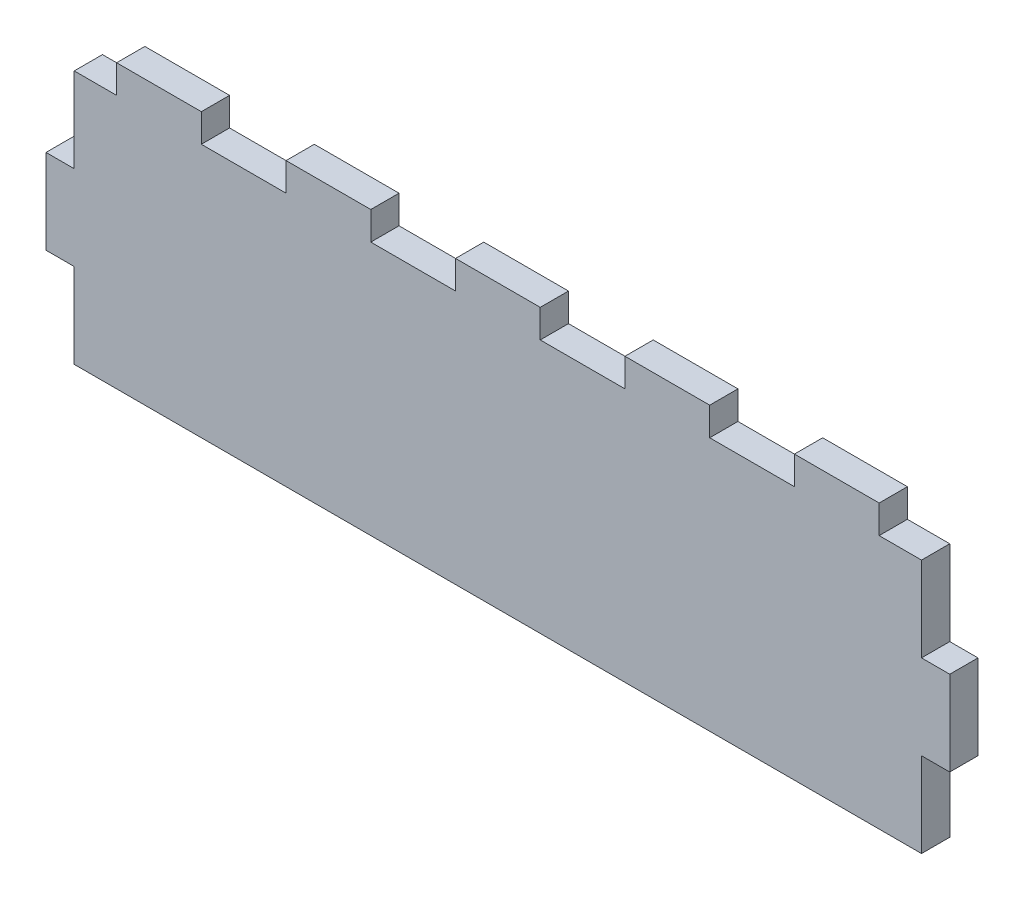
ISO-10303-21;
HEADER;
FILE_DESCRIPTION(('STEP AP214'),'2;1');
FILE_NAME('part.step','',(''),(''),'','','');
FILE_SCHEMA(('AUTOMOTIVE_DESIGN { 1 0 10303 214 1 1 1 1 }'));
ENDSEC;
DATA;
#1=APPLICATION_CONTEXT('core data for automotive mechanical design processes');
#2=APPLICATION_PROTOCOL_DEFINITION('international standard','automotive_design',2000,#1);
#3=PRODUCT_CONTEXT('',#1,'mechanical');
#4=PRODUCT('Part','Part','',(#3));
#5=PRODUCT_RELATED_PRODUCT_CATEGORY('part','',(#4));
#6=PRODUCT_DEFINITION_FORMATION('','',#4);
#7=PRODUCT_DEFINITION_CONTEXT('part definition',#1,'design');
#8=PRODUCT_DEFINITION('design','',#6,#7);
#9=PRODUCT_DEFINITION_SHAPE('','',#8);
#10=(LENGTH_UNIT() NAMED_UNIT(*) SI_UNIT(.MILLI.,.METRE.));
#11=(NAMED_UNIT(*) PLANE_ANGLE_UNIT() SI_UNIT($,.RADIAN.));
#12=(NAMED_UNIT(*) SI_UNIT($,.STERADIAN.) SOLID_ANGLE_UNIT());
#13=UNCERTAINTY_MEASURE_WITH_UNIT(LENGTH_MEASURE(1.E-05),#10,'distance_accuracy_value','');
#14=(GEOMETRIC_REPRESENTATION_CONTEXT(3) GLOBAL_UNCERTAINTY_ASSIGNED_CONTEXT((#13)) GLOBAL_UNIT_ASSIGNED_CONTEXT((#10,
#11,#12)) REPRESENTATION_CONTEXT('',''));
#15=CARTESIAN_POINT('',(0.,0.,0.));
#16=DIRECTION('',(0.,0.,1.));
#17=DIRECTION('',(1.,0.,0.));
#18=AXIS2_PLACEMENT_3D('',#15,#16,#17);
#19=CARTESIAN_POINT('',(101.6,31.75,3.175));
#20=DIRECTION('',(-1.,0.,0.));
#21=DIRECTION('',(0.,0.,1.));
#22=AXIS2_PLACEMENT_3D('',#19,#20,#21);
#23=PLANE('',#22);
#24=DIRECTION('',(0.,0.,1.));
#25=VECTOR('',#24,1.);
#26=CARTESIAN_POINT('',(101.6,6.35,-3.175));
#27=LINE('',#26,#25);
#28=CARTESIAN_POINT('',(101.6,6.35,-3.175));
#29=VERTEX_POINT('',#28);
#30=CARTESIAN_POINT('',(101.6,6.35,3.175));
#31=VERTEX_POINT('',#30);
#32=EDGE_CURVE('E248',#29,#31,#27,.T.);
#33=ORIENTED_EDGE('',*,*,#32,.T.);
#34=DIRECTION('',(0.,1.,0.));
#35=VECTOR('',#34,1.);
#36=CARTESIAN_POINT('',(101.6,31.75,3.175));
#37=LINE('',#36,#35);
#38=CARTESIAN_POINT('',(101.6,-12.7,3.175));
#39=VERTEX_POINT('',#38);
#40=EDGE_CURVE('E455',#39,#31,#37,.T.);
#41=ORIENTED_EDGE('',*,*,#40,.F.);
#42=DIRECTION('',(0.,0.,1.));
#43=VECTOR('',#42,1.);
#44=CARTESIAN_POINT('',(101.6,-12.7,-3.175));
#45=LINE('',#44,#43);
#46=CARTESIAN_POINT('',(101.6,-12.7,-3.175));
#47=VERTEX_POINT('',#46);
#48=EDGE_CURVE('E276',#47,#39,#45,.T.);
#49=ORIENTED_EDGE('',*,*,#48,.F.);
#50=DIRECTION('',(0.,1.,0.));
#51=VECTOR('',#50,1.);
#52=CARTESIAN_POINT('',(101.6,31.75,-3.175));
#53=LINE('',#52,#51);
#54=EDGE_CURVE('E452',#47,#29,#53,.T.);
#55=ORIENTED_EDGE('',*,*,#54,.T.);
#56=EDGE_LOOP('',(#33,#41,#49,#55));
#57=FACE_BOUND('',#56,.T.);
#58=ADVANCED_FACE('F33',(#57),#23,.F.);
#59=CARTESIAN_POINT('',(0.,0.,3.175));
#60=DIRECTION('',(0.,0.,1.));
#61=DIRECTION('',(1.,0.,0.));
#62=AXIS2_PLACEMENT_3D('',#59,#60,#61);
#63=PLANE('',#62);
#64=ORIENTED_EDGE('',*,*,#40,.T.);
#65=DIRECTION('',(-1.,0.,0.));
#66=VECTOR('',#65,1.);
#67=CARTESIAN_POINT('',(101.6,6.35,3.175));
#68=LINE('',#67,#66);
#69=CARTESIAN_POINT('',(95.25,6.35,3.175));
#70=VERTEX_POINT('',#69);
#71=EDGE_CURVE('E263',#31,#70,#68,.T.);
#72=ORIENTED_EDGE('',*,*,#71,.T.);
#73=DIRECTION('',(0.,1.,0.));
#74=VECTOR('',#73,1.);
#75=CARTESIAN_POINT('',(95.25,25.4,3.175));
#76=LINE('',#75,#74);
#77=CARTESIAN_POINT('',(95.25,25.4,3.175));
#78=VERTEX_POINT('',#77);
#79=EDGE_CURVE('E256',#70,#78,#76,.T.);
#80=ORIENTED_EDGE('',*,*,#79,.T.);
#81=DIRECTION('',(-1.,0.,0.));
#82=VECTOR('',#81,1.);
#83=CARTESIAN_POINT('',(101.6,25.4,3.175));
#84=LINE('',#83,#82);
#85=CARTESIAN_POINT('',(85.725,25.4,3.175));
#86=VERTEX_POINT('',#85);
#87=EDGE_CURVE('E428',#78,#86,#84,.T.);
#88=ORIENTED_EDGE('',*,*,#87,.T.);
#89=DIRECTION('',(0.,1.,0.));
#90=VECTOR('',#89,1.);
#91=CARTESIAN_POINT('',(85.725,31.75,3.175));
#92=LINE('',#91,#90);
#93=CARTESIAN_POINT('',(85.725,31.75,3.175));
#94=VERTEX_POINT('',#93);
#95=EDGE_CURVE('E419',#86,#94,#92,.T.);
#96=ORIENTED_EDGE('',*,*,#95,.T.);
#97=DIRECTION('',(-1.,0.,0.));
#98=VECTOR('',#97,1.);
#99=CARTESIAN_POINT('',(-101.6,31.75,3.175));
#100=LINE('',#99,#98);
#101=CARTESIAN_POINT('',(66.675,31.75,3.175));
#102=VERTEX_POINT('',#101);
#103=EDGE_CURVE('E459',#94,#102,#100,.T.);
#104=ORIENTED_EDGE('',*,*,#103,.T.);
#105=DIRECTION('',(0.,1.,0.));
#106=VECTOR('',#105,1.);
#107=CARTESIAN_POINT('',(66.675,31.75,3.175));
#108=LINE('',#107,#106);
#109=CARTESIAN_POINT('',(66.675,25.4,3.175));
#110=VERTEX_POINT('',#109);
#111=EDGE_CURVE('E379',#110,#102,#108,.T.);
#112=ORIENTED_EDGE('',*,*,#111,.F.);
#113=DIRECTION('',(1.,0.,0.));
#114=VECTOR('',#113,1.);
#115=CARTESIAN_POINT('',(47.625,25.4,3.175));
#116=LINE('',#115,#114);
#117=CARTESIAN_POINT('',(47.625,25.4,3.175));
#118=VERTEX_POINT('',#117);
#119=EDGE_CURVE('E388',#118,#110,#116,.T.);
#120=ORIENTED_EDGE('',*,*,#119,.F.);
#121=DIRECTION('',(0.,-1.,0.));
#122=VECTOR('',#121,1.);
#123=CARTESIAN_POINT('',(47.625,31.75,3.175));
#124=LINE('',#123,#122);
#125=CARTESIAN_POINT('',(47.625,31.75,3.175));
#126=VERTEX_POINT('',#125);
#127=EDGE_CURVE('E301',#126,#118,#124,.T.);
#128=ORIENTED_EDGE('',*,*,#127,.F.);
#129=CARTESIAN_POINT('',(28.5749999999999,31.75,3.175));
#130=VERTEX_POINT('',#129);
#131=EDGE_CURVE('E462',#126,#130,#100,.T.);
#132=ORIENTED_EDGE('',*,*,#131,.T.);
#133=DIRECTION('',(0.,1.,0.));
#134=VECTOR('',#133,1.);
#135=CARTESIAN_POINT('',(28.5749999999999,31.75,3.175));
#136=LINE('',#135,#134);
#137=CARTESIAN_POINT('',(28.5749999999999,25.4,3.175));
#138=VERTEX_POINT('',#137);
#139=EDGE_CURVE('E353',#138,#130,#136,.T.);
#140=ORIENTED_EDGE('',*,*,#139,.F.);
#141=DIRECTION('',(1.,0.,0.));
#142=VECTOR('',#141,1.);
#143=CARTESIAN_POINT('',(9.52499999999998,25.4,3.175));
#144=LINE('',#143,#142);
#145=CARTESIAN_POINT('',(9.52499999999998,25.4,3.175));
#146=VERTEX_POINT('',#145);
#147=EDGE_CURVE('E363',#146,#138,#144,.T.);
#148=ORIENTED_EDGE('',*,*,#147,.F.);
#149=DIRECTION('',(0.,-1.,0.));
#150=VECTOR('',#149,1.);
#151=CARTESIAN_POINT('',(9.52499999999995,31.75,3.175));
#152=LINE('',#151,#150);
#153=CARTESIAN_POINT('',(9.52499999999995,31.75,3.175));
#154=VERTEX_POINT('',#153);
#155=EDGE_CURVE('E360',#154,#146,#152,.T.);
#156=ORIENTED_EDGE('',*,*,#155,.F.);
#157=CARTESIAN_POINT('',(-9.52500000000005,31.75,3.175));
#158=VERTEX_POINT('',#157);
#159=EDGE_CURVE('E547',#154,#158,#100,.T.);
#160=ORIENTED_EDGE('',*,*,#159,.T.);
#161=DIRECTION('',(0.,1.,0.));
#162=VECTOR('',#161,1.);
#163=CARTESIAN_POINT('',(-9.52500000000005,31.75,3.175));
#164=LINE('',#163,#162);
#165=CARTESIAN_POINT('',(-9.52500000000005,25.4,3.175));
#166=VERTEX_POINT('',#165);
#167=EDGE_CURVE('E325',#166,#158,#164,.T.);
#168=ORIENTED_EDGE('',*,*,#167,.F.);
#169=DIRECTION('',(1.,0.,0.));
#170=VECTOR('',#169,1.);
#171=CARTESIAN_POINT('',(-28.575,25.4,3.175));
#172=LINE('',#171,#170);
#173=CARTESIAN_POINT('',(-28.575,25.4,3.175));
#174=VERTEX_POINT('',#173);
#175=EDGE_CURVE('E335',#174,#166,#172,.T.);
#176=ORIENTED_EDGE('',*,*,#175,.F.);
#177=DIRECTION('',(0.,-1.,0.));
#178=VECTOR('',#177,1.);
#179=CARTESIAN_POINT('',(-28.5750000000001,31.75,3.175));
#180=LINE('',#179,#178);
#181=CARTESIAN_POINT('',(-28.5750000000001,31.75,3.175));
#182=VERTEX_POINT('',#181);
#183=EDGE_CURVE('E332',#182,#174,#180,.T.);
#184=ORIENTED_EDGE('',*,*,#183,.F.);
#185=CARTESIAN_POINT('',(-47.6250000000001,31.75,3.175));
#186=VERTEX_POINT('',#185);
#187=EDGE_CURVE('E463',#182,#186,#100,.T.);
#188=ORIENTED_EDGE('',*,*,#187,.T.);
#189=DIRECTION('',(0.,1.,0.));
#190=VECTOR('',#189,1.);
#191=CARTESIAN_POINT('',(-47.6250000000001,31.75,3.175));
#192=LINE('',#191,#190);
#193=CARTESIAN_POINT('',(-47.6250000000001,25.4,3.175));
#194=VERTEX_POINT('',#193);
#195=EDGE_CURVE('E403',#194,#186,#192,.T.);
#196=ORIENTED_EDGE('',*,*,#195,.F.);
#197=DIRECTION('',(1.,0.,0.));
#198=VECTOR('',#197,1.);
#199=CARTESIAN_POINT('',(-66.675,25.4,3.175));
#200=LINE('',#199,#198);
#201=CARTESIAN_POINT('',(-66.675,25.4,3.175));
#202=VERTEX_POINT('',#201);
#203=EDGE_CURVE('E412',#202,#194,#200,.T.);
#204=ORIENTED_EDGE('',*,*,#203,.F.);
#205=DIRECTION('',(0.,-1.,0.));
#206=VECTOR('',#205,1.);
#207=CARTESIAN_POINT('',(-66.6750000000001,31.75,3.175));
#208=LINE('',#207,#206);
#209=CARTESIAN_POINT('',(-66.6750000000001,31.75,3.175));
#210=VERTEX_POINT('',#209);
#211=EDGE_CURVE('E342',#210,#202,#208,.T.);
#212=ORIENTED_EDGE('',*,*,#211,.F.);
#213=CARTESIAN_POINT('',(-85.725,31.75,3.175));
#214=VERTEX_POINT('',#213);
#215=EDGE_CURVE('E458',#210,#214,#100,.T.);
#216=ORIENTED_EDGE('',*,*,#215,.T.);
#217=DIRECTION('',(0.,1.,0.));
#218=VECTOR('',#217,1.);
#219=CARTESIAN_POINT('',(-85.725,31.75,3.175));
#220=LINE('',#219,#218);
#221=CARTESIAN_POINT('',(-85.725,25.4,3.175));
#222=VERTEX_POINT('',#221);
#223=EDGE_CURVE('E442',#222,#214,#220,.T.);
#224=ORIENTED_EDGE('',*,*,#223,.F.);
#225=DIRECTION('',(1.,0.,0.));
#226=VECTOR('',#225,1.);
#227=CARTESIAN_POINT('',(-101.6,25.4,3.175));
#228=LINE('',#227,#226);
#229=CARTESIAN_POINT('',(-95.25,25.4,3.175));
#230=VERTEX_POINT('',#229);
#231=EDGE_CURVE('E437',#230,#222,#228,.T.);
#232=ORIENTED_EDGE('',*,*,#231,.F.);
#233=DIRECTION('',(0.,1.,0.));
#234=VECTOR('',#233,1.);
#235=CARTESIAN_POINT('',(-95.25,25.4,3.175));
#236=LINE('',#235,#234);
#237=CARTESIAN_POINT('',(-95.25,6.35,3.175));
#238=VERTEX_POINT('',#237);
#239=EDGE_CURVE('E289',#238,#230,#236,.T.);
#240=ORIENTED_EDGE('',*,*,#239,.F.);
#241=DIRECTION('',(1.,0.,0.));
#242=VECTOR('',#241,1.);
#243=CARTESIAN_POINT('',(-101.6,6.35,3.175));
#244=LINE('',#243,#242);
#245=CARTESIAN_POINT('',(-101.6,6.35,3.175));
#246=VERTEX_POINT('',#245);
#247=EDGE_CURVE('E293',#246,#238,#244,.T.);
#248=ORIENTED_EDGE('',*,*,#247,.F.);
#249=DIRECTION('',(0.,-1.,0.));
#250=VECTOR('',#249,1.);
#251=CARTESIAN_POINT('',(-101.6,31.75,3.175));
#252=LINE('',#251,#250);
#253=CARTESIAN_POINT('',(-101.6,-12.7,3.175));
#254=VERTEX_POINT('',#253);
#255=EDGE_CURVE('E41',#246,#254,#252,.T.);
#256=ORIENTED_EDGE('',*,*,#255,.T.);
#257=DIRECTION('',(-1.,0.,0.));
#258=VECTOR('',#257,1.);
#259=CARTESIAN_POINT('',(-101.6,-12.7,3.175));
#260=LINE('',#259,#258);
#261=CARTESIAN_POINT('',(-95.25,-12.7,3.175));
#262=VERTEX_POINT('',#261);
#263=EDGE_CURVE('E309',#262,#254,#260,.T.);
#264=ORIENTED_EDGE('',*,*,#263,.F.);
#265=DIRECTION('',(0.,1.,0.));
#266=VECTOR('',#265,1.);
#267=CARTESIAN_POINT('',(-95.25,-31.75,3.175));
#268=LINE('',#267,#266);
#269=CARTESIAN_POINT('',(-95.25,-31.75,3.175));
#270=VERTEX_POINT('',#269);
#271=EDGE_CURVE('E269',#270,#262,#268,.T.);
#272=ORIENTED_EDGE('',*,*,#271,.F.);
#273=DIRECTION('',(1.,0.,0.));
#274=VECTOR('',#273,1.);
#275=CARTESIAN_POINT('',(-101.6,-31.75,3.175));
#276=LINE('',#275,#274);
#277=CARTESIAN_POINT('',(95.25,-31.75,3.175));
#278=VERTEX_POINT('',#277);
#279=EDGE_CURVE('E11',#270,#278,#276,.T.);
#280=ORIENTED_EDGE('',*,*,#279,.T.);
#281=DIRECTION('',(0.,1.,0.));
#282=VECTOR('',#281,1.);
#283=CARTESIAN_POINT('',(95.25,-31.75,3.175));
#284=LINE('',#283,#282);
#285=CARTESIAN_POINT('',(95.25,-12.7,3.175));
#286=VERTEX_POINT('',#285);
#287=EDGE_CURVE('E49',#278,#286,#284,.T.);
#288=ORIENTED_EDGE('',*,*,#287,.T.);
#289=DIRECTION('',(1.,0.,0.));
#290=VECTOR('',#289,1.);
#291=CARTESIAN_POINT('',(101.6,-12.7,3.175));
#292=LINE('',#291,#290);
#293=EDGE_CURVE('E277',#286,#39,#292,.T.);
#294=ORIENTED_EDGE('',*,*,#293,.T.);
#295=EDGE_LOOP('',(#64,#72,#80,#88,#96,#104,#112,#120,#128,#132,#140,#148,#156,#160,#168,#176,
#184,#188,#196,#204,#212,#216,#224,#232,#240,#248,#256,#264,#272,#280,#288,#294));
#296=FACE_BOUND('',#295,.T.);
#297=ADVANCED_FACE('F493',(#296),#63,.T.);
#298=CARTESIAN_POINT('',(0.,0.,-3.175));
#299=DIRECTION('',(0.,0.,1.));
#300=DIRECTION('',(1.,0.,0.));
#301=AXIS2_PLACEMENT_3D('',#298,#299,#300);
#302=PLANE('',#301);
#303=DIRECTION('',(-1.,0.,0.));
#304=VECTOR('',#303,1.);
#305=CARTESIAN_POINT('',(101.6,6.35,-3.175));
#306=LINE('',#305,#304);
#307=CARTESIAN_POINT('',(95.25,6.35,-3.175));
#308=VERTEX_POINT('',#307);
#309=EDGE_CURVE('E243',#29,#308,#306,.T.);
#310=ORIENTED_EDGE('',*,*,#309,.F.);
#311=ORIENTED_EDGE('',*,*,#54,.F.);
#312=DIRECTION('',(1.,0.,0.));
#313=VECTOR('',#312,1.);
#314=CARTESIAN_POINT('',(101.6,-12.7,-3.175));
#315=LINE('',#314,#313);
#316=CARTESIAN_POINT('',(95.25,-12.7,-3.175));
#317=VERTEX_POINT('',#316);
#318=EDGE_CURVE('E272',#317,#47,#315,.T.);
#319=ORIENTED_EDGE('',*,*,#318,.F.);
#320=DIRECTION('',(0.,1.,0.));
#321=VECTOR('',#320,1.);
#322=CARTESIAN_POINT('',(95.25,-31.75,-3.175));
#323=LINE('',#322,#321);
#324=CARTESIAN_POINT('',(95.25,-31.75,-3.175));
#325=VERTEX_POINT('',#324);
#326=EDGE_CURVE('E274',#325,#317,#323,.T.);
#327=ORIENTED_EDGE('',*,*,#326,.F.);
#328=DIRECTION('',(1.,0.,0.));
#329=VECTOR('',#328,1.);
#330=CARTESIAN_POINT('',(-101.6,-31.75,-3.175));
#331=LINE('',#330,#329);
#332=CARTESIAN_POINT('',(-95.25,-31.75,-3.175));
#333=VERTEX_POINT('',#332);
#334=EDGE_CURVE('E36',#333,#325,#331,.T.);
#335=ORIENTED_EDGE('',*,*,#334,.F.);
#336=DIRECTION('',(0.,1.,0.));
#337=VECTOR('',#336,1.);
#338=CARTESIAN_POINT('',(-95.25,-31.75,-3.175));
#339=LINE('',#338,#337);
#340=CARTESIAN_POINT('',(-95.25,-12.7,-3.175));
#341=VERTEX_POINT('',#340);
#342=EDGE_CURVE('E305',#333,#341,#339,.T.);
#343=ORIENTED_EDGE('',*,*,#342,.T.);
#344=DIRECTION('',(-1.,0.,0.));
#345=VECTOR('',#344,1.);
#346=CARTESIAN_POINT('',(-101.6,-12.7,-3.175));
#347=LINE('',#346,#345);
#348=CARTESIAN_POINT('',(-101.6,-12.7,-3.175));
#349=VERTEX_POINT('',#348);
#350=EDGE_CURVE('E308',#341,#349,#347,.T.);
#351=ORIENTED_EDGE('',*,*,#350,.T.);
#352=DIRECTION('',(0.,-1.,0.));
#353=VECTOR('',#352,1.);
#354=CARTESIAN_POINT('',(-101.6,31.75,-3.175));
#355=LINE('',#354,#353);
#356=CARTESIAN_POINT('',(-101.6,6.35,-3.175));
#357=VERTEX_POINT('',#356);
#358=EDGE_CURVE('E470',#357,#349,#355,.T.);
#359=ORIENTED_EDGE('',*,*,#358,.F.);
#360=DIRECTION('',(1.,0.,0.));
#361=VECTOR('',#360,1.);
#362=CARTESIAN_POINT('',(-101.6,6.35,-3.175));
#363=LINE('',#362,#361);
#364=CARTESIAN_POINT('',(-95.25,6.35,-3.175));
#365=VERTEX_POINT('',#364);
#366=EDGE_CURVE('E285',#357,#365,#363,.T.);
#367=ORIENTED_EDGE('',*,*,#366,.T.);
#368=DIRECTION('',(0.,1.,0.));
#369=VECTOR('',#368,1.);
#370=CARTESIAN_POINT('',(-95.25,25.4,-3.175));
#371=LINE('',#370,#369);
#372=CARTESIAN_POINT('',(-95.25,25.4,-3.175));
#373=VERTEX_POINT('',#372);
#374=EDGE_CURVE('E288',#365,#373,#371,.T.);
#375=ORIENTED_EDGE('',*,*,#374,.T.);
#376=DIRECTION('',(1.,0.,0.));
#377=VECTOR('',#376,1.);
#378=CARTESIAN_POINT('',(-101.6,25.4,-3.175));
#379=LINE('',#378,#377);
#380=CARTESIAN_POINT('',(-85.725,25.4,-3.175));
#381=VERTEX_POINT('',#380);
#382=EDGE_CURVE('E439',#373,#381,#379,.T.);
#383=ORIENTED_EDGE('',*,*,#382,.T.);
#384=DIRECTION('',(0.,1.,0.));
#385=VECTOR('',#384,1.);
#386=CARTESIAN_POINT('',(-85.725,31.75,-3.175));
#387=LINE('',#386,#385);
#388=CARTESIAN_POINT('',(-85.725,31.75,-3.175));
#389=VERTEX_POINT('',#388);
#390=EDGE_CURVE('E441',#381,#389,#387,.T.);
#391=ORIENTED_EDGE('',*,*,#390,.T.);
#392=DIRECTION('',(-1.,0.,0.));
#393=VECTOR('',#392,1.);
#394=CARTESIAN_POINT('',(-101.6,31.75,-3.175));
#395=LINE('',#394,#393);
#396=CARTESIAN_POINT('',(-66.6750000000001,31.75,-3.175));
#397=VERTEX_POINT('',#396);
#398=EDGE_CURVE('E467',#397,#389,#395,.T.);
#399=ORIENTED_EDGE('',*,*,#398,.F.);
#400=DIRECTION('',(0.,-1.,0.));
#401=VECTOR('',#400,1.);
#402=CARTESIAN_POINT('',(-66.6750000000001,31.75,-3.175));
#403=LINE('',#402,#401);
#404=CARTESIAN_POINT('',(-66.675,25.4,-3.175));
#405=VERTEX_POINT('',#404);
#406=EDGE_CURVE('E399',#397,#405,#403,.T.);
#407=ORIENTED_EDGE('',*,*,#406,.T.);
#408=DIRECTION('',(1.,0.,0.));
#409=VECTOR('',#408,1.);
#410=CARTESIAN_POINT('',(-66.675,25.4,-3.175));
#411=LINE('',#410,#409);
#412=CARTESIAN_POINT('',(-47.6250000000001,25.4,-3.175));
#413=VERTEX_POINT('',#412);
#414=EDGE_CURVE('E402',#405,#413,#411,.T.);
#415=ORIENTED_EDGE('',*,*,#414,.T.);
#416=DIRECTION('',(0.,1.,0.));
#417=VECTOR('',#416,1.);
#418=CARTESIAN_POINT('',(-47.6250000000001,31.75,-3.175));
#419=LINE('',#418,#417);
#420=CARTESIAN_POINT('',(-47.6250000000001,31.75,-3.175));
#421=VERTEX_POINT('',#420);
#422=EDGE_CURVE('E406',#413,#421,#419,.T.);
#423=ORIENTED_EDGE('',*,*,#422,.T.);
#424=CARTESIAN_POINT('',(-28.5750000000001,31.75,-3.175));
#425=VERTEX_POINT('',#424);
#426=EDGE_CURVE('E472',#425,#421,#395,.T.);
#427=ORIENTED_EDGE('',*,*,#426,.F.);
#428=DIRECTION('',(0.,-1.,0.));
#429=VECTOR('',#428,1.);
#430=CARTESIAN_POINT('',(-28.5750000000001,31.75,-3.175));
#431=LINE('',#430,#429);
#432=CARTESIAN_POINT('',(-28.575,25.4,-3.175));
#433=VERTEX_POINT('',#432);
#434=EDGE_CURVE('E321',#425,#433,#431,.T.);
#435=ORIENTED_EDGE('',*,*,#434,.T.);
#436=DIRECTION('',(1.,0.,0.));
#437=VECTOR('',#436,1.);
#438=CARTESIAN_POINT('',(-28.575,25.4,-3.175));
#439=LINE('',#438,#437);
#440=CARTESIAN_POINT('',(-9.52500000000005,25.4,-3.175));
#441=VERTEX_POINT('',#440);
#442=EDGE_CURVE('E324',#433,#441,#439,.T.);
#443=ORIENTED_EDGE('',*,*,#442,.T.);
#444=DIRECTION('',(0.,1.,0.));
#445=VECTOR('',#444,1.);
#446=CARTESIAN_POINT('',(-9.52500000000005,31.75,-3.175));
#447=LINE('',#446,#445);
#448=CARTESIAN_POINT('',(-9.52500000000005,31.75,-3.175));
#449=VERTEX_POINT('',#448);
#450=EDGE_CURVE('E328',#441,#449,#447,.T.);
#451=ORIENTED_EDGE('',*,*,#450,.T.);
#452=CARTESIAN_POINT('',(9.52499999999995,31.75,-3.175));
#453=VERTEX_POINT('',#452);
#454=EDGE_CURVE('E525',#453,#449,#395,.T.);
#455=ORIENTED_EDGE('',*,*,#454,.F.);
#456=DIRECTION('',(0.,-1.,0.));
#457=VECTOR('',#456,1.);
#458=CARTESIAN_POINT('',(9.52499999999995,31.75,-3.175));
#459=LINE('',#458,#457);
#460=CARTESIAN_POINT('',(9.52499999999998,25.4,-3.175));
#461=VERTEX_POINT('',#460);
#462=EDGE_CURVE('E349',#453,#461,#459,.T.);
#463=ORIENTED_EDGE('',*,*,#462,.T.);
#464=DIRECTION('',(1.,0.,0.));
#465=VECTOR('',#464,1.);
#466=CARTESIAN_POINT('',(9.52499999999998,25.4,-3.175));
#467=LINE('',#466,#465);
#468=CARTESIAN_POINT('',(28.5749999999999,25.4,-3.175));
#469=VERTEX_POINT('',#468);
#470=EDGE_CURVE('E352',#461,#469,#467,.T.);
#471=ORIENTED_EDGE('',*,*,#470,.T.);
#472=DIRECTION('',(0.,1.,0.));
#473=VECTOR('',#472,1.);
#474=CARTESIAN_POINT('',(28.5749999999999,31.75,-3.175));
#475=LINE('',#474,#473);
#476=CARTESIAN_POINT('',(28.5749999999999,31.75,-3.175));
#477=VERTEX_POINT('',#476);
#478=EDGE_CURVE('E356',#469,#477,#475,.T.);
#479=ORIENTED_EDGE('',*,*,#478,.T.);
#480=CARTESIAN_POINT('',(47.625,31.75,-3.175));
#481=VERTEX_POINT('',#480);
#482=EDGE_CURVE('E471',#481,#477,#395,.T.);
#483=ORIENTED_EDGE('',*,*,#482,.F.);
#484=DIRECTION('',(0.,-1.,0.));
#485=VECTOR('',#484,1.);
#486=CARTESIAN_POINT('',(47.625,31.75,-3.175));
#487=LINE('',#486,#485);
#488=CARTESIAN_POINT('',(47.625,25.4,-3.175));
#489=VERTEX_POINT('',#488);
#490=EDGE_CURVE('E375',#481,#489,#487,.T.);
#491=ORIENTED_EDGE('',*,*,#490,.T.);
#492=DIRECTION('',(1.,0.,0.));
#493=VECTOR('',#492,1.);
#494=CARTESIAN_POINT('',(47.625,25.4,-3.175));
#495=LINE('',#494,#493);
#496=CARTESIAN_POINT('',(66.675,25.4,-3.175));
#497=VERTEX_POINT('',#496);
#498=EDGE_CURVE('E378',#489,#497,#495,.T.);
#499=ORIENTED_EDGE('',*,*,#498,.T.);
#500=DIRECTION('',(0.,1.,0.));
#501=VECTOR('',#500,1.);
#502=CARTESIAN_POINT('',(66.675,31.75,-3.175));
#503=LINE('',#502,#501);
#504=CARTESIAN_POINT('',(66.675,31.75,-3.175));
#505=VERTEX_POINT('',#504);
#506=EDGE_CURVE('E382',#497,#505,#503,.T.);
#507=ORIENTED_EDGE('',*,*,#506,.T.);
#508=CARTESIAN_POINT('',(85.725,31.75,-3.175));
#509=VERTEX_POINT('',#508);
#510=EDGE_CURVE('E468',#509,#505,#395,.T.);
#511=ORIENTED_EDGE('',*,*,#510,.F.);
#512=DIRECTION('',(0.,1.,0.));
#513=VECTOR('',#512,1.);
#514=CARTESIAN_POINT('',(85.725,31.75,-3.175));
#515=LINE('',#514,#513);
#516=CARTESIAN_POINT('',(85.725,25.4,-3.175));
#517=VERTEX_POINT('',#516);
#518=EDGE_CURVE('E426',#517,#509,#515,.T.);
#519=ORIENTED_EDGE('',*,*,#518,.F.);
#520=DIRECTION('',(-1.,0.,0.));
#521=VECTOR('',#520,1.);
#522=CARTESIAN_POINT('',(101.6,25.4,-3.175));
#523=LINE('',#522,#521);
#524=CARTESIAN_POINT('',(95.25,25.4,-3.175));
#525=VERTEX_POINT('',#524);
#526=EDGE_CURVE('E262',#525,#517,#523,.T.);
#527=ORIENTED_EDGE('',*,*,#526,.F.);
#528=DIRECTION('',(0.,1.,0.));
#529=VECTOR('',#528,1.);
#530=CARTESIAN_POINT('',(95.25,25.4,-3.175));
#531=LINE('',#530,#529);
#532=EDGE_CURVE('E57',#308,#525,#531,.T.);
#533=ORIENTED_EDGE('',*,*,#532,.F.);
#534=EDGE_LOOP('',(#310,#311,#319,#327,#335,#343,#351,#359,#367,#375,#383,#391,#399,#407,#415,
#423,#427,#435,#443,#451,#455,#463,#471,#479,#483,#491,#499,#507,#511,#519,#527,#533));
#535=FACE_BOUND('',#534,.T.);
#536=ADVANCED_FACE('F260',(#535),#302,.F.);
#537=CARTESIAN_POINT('',(-101.6,-31.75,3.175));
#538=DIRECTION('',(0.,1.,0.));
#539=DIRECTION('',(0.,0.,1.));
#540=AXIS2_PLACEMENT_3D('',#537,#538,#539);
#541=PLANE('',#540);
#542=DIRECTION('',(0.,0.,1.));
#543=VECTOR('',#542,1.);
#544=CARTESIAN_POINT('',(95.25,-31.75,-3.175));
#545=LINE('',#544,#543);
#546=EDGE_CURVE('E267',#325,#278,#545,.T.);
#547=ORIENTED_EDGE('',*,*,#546,.T.);
#548=ORIENTED_EDGE('',*,*,#279,.F.);
#549=DIRECTION('',(0.,0.,1.));
#550=VECTOR('',#549,1.);
#551=CARTESIAN_POINT('',(-95.25,-31.75,-3.175));
#552=LINE('',#551,#550);
#553=EDGE_CURVE('E312',#333,#270,#552,.T.);
#554=ORIENTED_EDGE('',*,*,#553,.F.);
#555=ORIENTED_EDGE('',*,*,#334,.T.);
#556=EDGE_LOOP('',(#547,#548,#554,#555));
#557=FACE_BOUND('',#556,.T.);
#558=ADVANCED_FACE('F481',(#557),#541,.F.);
#559=CARTESIAN_POINT('',(101.6,25.4,-3.175));
#560=DIRECTION('',(0.,1.,0.));
#561=DIRECTION('',(-1.,0.,0.));
#562=AXIS2_PLACEMENT_3D('',#559,#560,#561);
#563=PLANE('',#562);
#564=ORIENTED_EDGE('',*,*,#87,.F.);
#565=DIRECTION('',(0.,0.,1.));
#566=VECTOR('',#565,1.);
#567=CARTESIAN_POINT('',(95.25,25.4,-3.175));
#568=LINE('',#567,#566);
#569=EDGE_CURVE('E252',#525,#78,#568,.T.);
#570=ORIENTED_EDGE('',*,*,#569,.F.);
#571=ORIENTED_EDGE('',*,*,#526,.T.);
#572=DIRECTION('',(0.,0.,1.));
#573=VECTOR('',#572,1.);
#574=CARTESIAN_POINT('',(85.725,25.4,-3.175));
#575=LINE('',#574,#573);
#576=EDGE_CURVE('E434',#517,#86,#575,.T.);
#577=ORIENTED_EDGE('',*,*,#576,.T.);
#578=EDGE_LOOP('',(#564,#570,#571,#577));
#579=FACE_BOUND('',#578,.T.);
#580=ADVANCED_FACE('F591',(#579),#563,.T.);
#581=CARTESIAN_POINT('',(-101.6,31.75,3.175));
#582=DIRECTION('',(0.,-1.,0.));
#583=DIRECTION('',(0.,0.,-1.));
#584=AXIS2_PLACEMENT_3D('',#581,#582,#583);
#585=PLANE('',#584);
#586=ORIENTED_EDGE('',*,*,#187,.F.);
#587=DIRECTION('',(0.,0.,1.));
#588=VECTOR('',#587,1.);
#589=CARTESIAN_POINT('',(-28.5750000000001,31.75,-3.175));
#590=LINE('',#589,#588);
#591=EDGE_CURVE('E340',#425,#182,#590,.T.);
#592=ORIENTED_EDGE('',*,*,#591,.F.);
#593=ORIENTED_EDGE('',*,*,#426,.T.);
#594=DIRECTION('',(0.,0.,1.));
#595=VECTOR('',#594,1.);
#596=CARTESIAN_POINT('',(-47.6250000000001,31.75,-3.175));
#597=LINE('',#596,#595);
#598=EDGE_CURVE('E420',#421,#186,#597,.T.);
#599=ORIENTED_EDGE('',*,*,#598,.T.);
#600=EDGE_LOOP('',(#586,#592,#593,#599));
#601=FACE_BOUND('',#600,.T.);
#602=ADVANCED_FACE('F565',(#601),#585,.F.);
#603=ORIENTED_EDGE('',*,*,#454,.T.);
#604=DIRECTION('',(0.,0.,1.));
#605=VECTOR('',#604,1.);
#606=CARTESIAN_POINT('',(-9.52500000000005,31.75,-3.175));
#607=LINE('',#606,#605);
#608=EDGE_CURVE('E343',#449,#158,#607,.T.);
#609=ORIENTED_EDGE('',*,*,#608,.T.);
#610=ORIENTED_EDGE('',*,*,#159,.F.);
#611=DIRECTION('',(0.,0.,1.));
#612=VECTOR('',#611,1.);
#613=CARTESIAN_POINT('',(9.52499999999995,31.75,-3.175));
#614=LINE('',#613,#612);
#615=EDGE_CURVE('E336',#453,#154,#614,.T.);
#616=ORIENTED_EDGE('',*,*,#615,.F.);
#617=EDGE_LOOP('',(#603,#609,#610,#616));
#618=FACE_BOUND('',#617,.T.);
#619=ADVANCED_FACE('F534',(#618),#585,.F.);
#620=ORIENTED_EDGE('',*,*,#482,.T.);
#621=DIRECTION('',(0.,0.,1.));
#622=VECTOR('',#621,1.);
#623=CARTESIAN_POINT('',(28.5749999999999,31.75,-3.175));
#624=LINE('',#623,#622);
#625=EDGE_CURVE('E369',#477,#130,#624,.T.);
#626=ORIENTED_EDGE('',*,*,#625,.T.);
#627=ORIENTED_EDGE('',*,*,#131,.F.);
#628=DIRECTION('',(0.,0.,1.));
#629=VECTOR('',#628,1.);
#630=CARTESIAN_POINT('',(47.625,31.75,-3.175));
#631=LINE('',#630,#629);
#632=EDGE_CURVE('E364',#481,#126,#631,.T.);
#633=ORIENTED_EDGE('',*,*,#632,.F.);
#634=EDGE_LOOP('',(#620,#626,#627,#633));
#635=FACE_BOUND('',#634,.T.);
#636=ADVANCED_FACE('F613',(#635),#585,.F.);
#637=ORIENTED_EDGE('',*,*,#215,.F.);
#638=DIRECTION('',(0.,0.,1.));
#639=VECTOR('',#638,1.);
#640=CARTESIAN_POINT('',(-66.6750000000001,31.75,-3.175));
#641=LINE('',#640,#639);
#642=EDGE_CURVE('E417',#397,#210,#641,.T.);
#643=ORIENTED_EDGE('',*,*,#642,.F.);
#644=ORIENTED_EDGE('',*,*,#398,.T.);
#645=DIRECTION('',(0.,0.,1.));
#646=VECTOR('',#645,1.);
#647=CARTESIAN_POINT('',(-85.725,31.75,-3.175));
#648=LINE('',#647,#646);
#649=EDGE_CURVE('E449',#389,#214,#648,.T.);
#650=ORIENTED_EDGE('',*,*,#649,.T.);
#651=EDGE_LOOP('',(#637,#643,#644,#650));
#652=FACE_BOUND('',#651,.T.);
#653=ADVANCED_FACE('F523',(#652),#585,.F.);
#654=ORIENTED_EDGE('',*,*,#510,.T.);
#655=DIRECTION('',(0.,0.,1.));
#656=VECTOR('',#655,1.);
#657=CARTESIAN_POINT('',(66.675,31.75,-3.175));
#658=LINE('',#657,#656);
#659=EDGE_CURVE('E393',#505,#102,#658,.T.);
#660=ORIENTED_EDGE('',*,*,#659,.T.);
#661=ORIENTED_EDGE('',*,*,#103,.F.);
#662=DIRECTION('',(0.,0.,1.));
#663=VECTOR('',#662,1.);
#664=CARTESIAN_POINT('',(85.725,31.75,-3.175));
#665=LINE('',#664,#663);
#666=EDGE_CURVE('E430',#509,#94,#665,.T.);
#667=ORIENTED_EDGE('',*,*,#666,.F.);
#668=EDGE_LOOP('',(#654,#660,#661,#667));
#669=FACE_BOUND('',#668,.T.);
#670=ADVANCED_FACE('F600',(#669),#585,.F.);
#671=CARTESIAN_POINT('',(-101.6,31.75,3.175));
#672=DIRECTION('',(1.,0.,0.));
#673=DIRECTION('',(0.,1.,0.));
#674=AXIS2_PLACEMENT_3D('',#671,#672,#673);
#675=PLANE('',#674);
#676=ORIENTED_EDGE('',*,*,#255,.F.);
#677=DIRECTION('',(0.,0.,1.));
#678=VECTOR('',#677,1.);
#679=CARTESIAN_POINT('',(-101.6,6.35,-3.175));
#680=LINE('',#679,#678);
#681=EDGE_CURVE('E292',#357,#246,#680,.T.);
#682=ORIENTED_EDGE('',*,*,#681,.F.);
#683=ORIENTED_EDGE('',*,*,#358,.T.);
#684=DIRECTION('',(0.,0.,1.));
#685=VECTOR('',#684,1.);
#686=CARTESIAN_POINT('',(-101.6,-12.7,-3.175));
#687=LINE('',#686,#685);
#688=EDGE_CURVE('E296',#349,#254,#687,.T.);
#689=ORIENTED_EDGE('',*,*,#688,.T.);
#690=EDGE_LOOP('',(#676,#682,#683,#689));
#691=FACE_BOUND('',#690,.T.);
#692=ADVANCED_FACE('F507',(#691),#675,.F.);
#693=CARTESIAN_POINT('',(-85.725,31.75,-3.175));
#694=DIRECTION('',(1.,0.,0.));
#695=DIRECTION('',(0.,0.,-1.));
#696=AXIS2_PLACEMENT_3D('',#693,#694,#695);
#697=PLANE('',#696);
#698=ORIENTED_EDGE('',*,*,#223,.T.);
#699=ORIENTED_EDGE('',*,*,#649,.F.);
#700=ORIENTED_EDGE('',*,*,#390,.F.);
#701=DIRECTION('',(0.,0.,1.));
#702=VECTOR('',#701,1.);
#703=CARTESIAN_POINT('',(-85.725,25.4,-3.175));
#704=LINE('',#703,#702);
#705=EDGE_CURVE('E445',#381,#222,#704,.T.);
#706=ORIENTED_EDGE('',*,*,#705,.T.);
#707=EDGE_LOOP('',(#698,#699,#700,#706));
#708=FACE_BOUND('',#707,.T.);
#709=ADVANCED_FACE('F520',(#708),#697,.F.);
#710=CARTESIAN_POINT('',(-101.6,25.4,-3.175));
#711=DIRECTION('',(0.,-1.,0.));
#712=DIRECTION('',(1.,0.,0.));
#713=AXIS2_PLACEMENT_3D('',#710,#711,#712);
#714=PLANE('',#713);
#715=ORIENTED_EDGE('',*,*,#382,.F.);
#716=DIRECTION('',(0.,0.,1.));
#717=VECTOR('',#716,1.);
#718=CARTESIAN_POINT('',(-95.25,25.4,-3.175));
#719=LINE('',#718,#717);
#720=EDGE_CURVE('E298',#373,#230,#719,.T.);
#721=ORIENTED_EDGE('',*,*,#720,.T.);
#722=ORIENTED_EDGE('',*,*,#231,.T.);
#723=ORIENTED_EDGE('',*,*,#705,.F.);
#724=EDGE_LOOP('',(#715,#721,#722,#723));
#725=FACE_BOUND('',#724,.T.);
#726=ADVANCED_FACE('F514',(#725),#714,.F.);
#727=CARTESIAN_POINT('',(85.725,31.75,-3.175));
#728=DIRECTION('',(1.,0.,0.));
#729=DIRECTION('',(0.,0.,-1.));
#730=AXIS2_PLACEMENT_3D('',#727,#728,#729);
#731=PLANE('',#730);
#732=ORIENTED_EDGE('',*,*,#95,.F.);
#733=ORIENTED_EDGE('',*,*,#576,.F.);
#734=ORIENTED_EDGE('',*,*,#518,.T.);
#735=ORIENTED_EDGE('',*,*,#666,.T.);
#736=EDGE_LOOP('',(#732,#733,#734,#735));
#737=FACE_BOUND('',#736,.T.);
#738=ADVANCED_FACE('F595',(#737),#731,.T.);
#739=CARTESIAN_POINT('',(-66.6750000000001,31.75,-3.175));
#740=DIRECTION('',(-1.,0.,0.));
#741=DIRECTION('',(0.,-1.,0.));
#742=AXIS2_PLACEMENT_3D('',#739,#740,#741);
#743=PLANE('',#742);
#744=ORIENTED_EDGE('',*,*,#211,.T.);
#745=DIRECTION('',(0.,0.,1.));
#746=VECTOR('',#745,1.);
#747=CARTESIAN_POINT('',(-66.675,25.4,-3.175));
#748=LINE('',#747,#746);
#749=EDGE_CURVE('E409',#405,#202,#748,.T.);
#750=ORIENTED_EDGE('',*,*,#749,.F.);
#751=ORIENTED_EDGE('',*,*,#406,.F.);
#752=ORIENTED_EDGE('',*,*,#642,.T.);
#753=EDGE_LOOP('',(#744,#750,#751,#752));
#754=FACE_BOUND('',#753,.T.);
#755=ADVANCED_FACE('F555',(#754),#743,.F.);
#756=CARTESIAN_POINT('',(-47.6250000000001,31.75,-3.175));
#757=DIRECTION('',(1.,0.,0.));
#758=DIRECTION('',(0.,0.,-1.));
#759=AXIS2_PLACEMENT_3D('',#756,#757,#758);
#760=PLANE('',#759);
#761=ORIENTED_EDGE('',*,*,#195,.T.);
#762=ORIENTED_EDGE('',*,*,#598,.F.);
#763=ORIENTED_EDGE('',*,*,#422,.F.);
#764=DIRECTION('',(0.,0.,1.));
#765=VECTOR('',#764,1.);
#766=CARTESIAN_POINT('',(-47.6250000000001,25.4,-3.175));
#767=LINE('',#766,#765);
#768=EDGE_CURVE('E423',#413,#194,#767,.T.);
#769=ORIENTED_EDGE('',*,*,#768,.T.);
#770=EDGE_LOOP('',(#761,#762,#763,#769));
#771=FACE_BOUND('',#770,.T.);
#772=ADVANCED_FACE('F562',(#771),#760,.F.);
#773=CARTESIAN_POINT('',(-66.675,25.4,-3.175));
#774=DIRECTION('',(0.,-1.,0.));
#775=DIRECTION('',(0.,0.,-1.));
#776=AXIS2_PLACEMENT_3D('',#773,#774,#775);
#777=PLANE('',#776);
#778=ORIENTED_EDGE('',*,*,#203,.T.);
#779=ORIENTED_EDGE('',*,*,#768,.F.);
#780=ORIENTED_EDGE('',*,*,#414,.F.);
#781=ORIENTED_EDGE('',*,*,#749,.T.);
#782=EDGE_LOOP('',(#778,#779,#780,#781));
#783=FACE_BOUND('',#782,.T.);
#784=ADVANCED_FACE('F560',(#783),#777,.F.);
#785=CARTESIAN_POINT('',(47.625,31.75,-3.175));
#786=DIRECTION('',(-1.,0.,0.));
#787=DIRECTION('',(0.,-1.,0.));
#788=AXIS2_PLACEMENT_3D('',#785,#786,#787);
#789=PLANE('',#788);
#790=ORIENTED_EDGE('',*,*,#127,.T.);
#791=DIRECTION('',(0.,0.,1.));
#792=VECTOR('',#791,1.);
#793=CARTESIAN_POINT('',(47.625,25.4,-3.175));
#794=LINE('',#793,#792);
#795=EDGE_CURVE('E385',#489,#118,#794,.T.);
#796=ORIENTED_EDGE('',*,*,#795,.F.);
#797=ORIENTED_EDGE('',*,*,#490,.F.);
#798=ORIENTED_EDGE('',*,*,#632,.T.);
#799=EDGE_LOOP('',(#790,#796,#797,#798));
#800=FACE_BOUND('',#799,.T.);
#801=ADVANCED_FACE('F628',(#800),#789,.F.);
#802=CARTESIAN_POINT('',(66.675,31.75,-3.175));
#803=DIRECTION('',(1.,0.,0.));
#804=DIRECTION('',(0.,0.,-1.));
#805=AXIS2_PLACEMENT_3D('',#802,#803,#804);
#806=PLANE('',#805);
#807=ORIENTED_EDGE('',*,*,#111,.T.);
#808=ORIENTED_EDGE('',*,*,#659,.F.);
#809=ORIENTED_EDGE('',*,*,#506,.F.);
#810=DIRECTION('',(0.,0.,1.));
#811=VECTOR('',#810,1.);
#812=CARTESIAN_POINT('',(66.675,25.4,-3.175));
#813=LINE('',#812,#811);
#814=EDGE_CURVE('E396',#497,#110,#813,.T.);
#815=ORIENTED_EDGE('',*,*,#814,.T.);
#816=EDGE_LOOP('',(#807,#808,#809,#815));
#817=FACE_BOUND('',#816,.T.);
#818=ADVANCED_FACE('F603',(#817),#806,.F.);
#819=CARTESIAN_POINT('',(47.625,25.4,-3.175));
#820=DIRECTION('',(0.,-1.,0.));
#821=DIRECTION('',(0.,0.,-1.));
#822=AXIS2_PLACEMENT_3D('',#819,#820,#821);
#823=PLANE('',#822);
#824=ORIENTED_EDGE('',*,*,#119,.T.);
#825=ORIENTED_EDGE('',*,*,#814,.F.);
#826=ORIENTED_EDGE('',*,*,#498,.F.);
#827=ORIENTED_EDGE('',*,*,#795,.T.);
#828=EDGE_LOOP('',(#824,#825,#826,#827));
#829=FACE_BOUND('',#828,.T.);
#830=ADVANCED_FACE('F607',(#829),#823,.F.);
#831=CARTESIAN_POINT('',(9.52499999999995,31.75,-3.175));
#832=DIRECTION('',(-1.,0.,0.));
#833=DIRECTION('',(0.,-1.,0.));
#834=AXIS2_PLACEMENT_3D('',#831,#832,#833);
#835=PLANE('',#834);
#836=ORIENTED_EDGE('',*,*,#155,.T.);
#837=DIRECTION('',(0.,0.,1.));
#838=VECTOR('',#837,1.);
#839=CARTESIAN_POINT('',(9.52499999999998,25.4,-3.175));
#840=LINE('',#839,#838);
#841=EDGE_CURVE('E359',#461,#146,#840,.T.);
#842=ORIENTED_EDGE('',*,*,#841,.F.);
#843=ORIENTED_EDGE('',*,*,#462,.F.);
#844=ORIENTED_EDGE('',*,*,#615,.T.);
#845=EDGE_LOOP('',(#836,#842,#843,#844));
#846=FACE_BOUND('',#845,.T.);
#847=ADVANCED_FACE('F618',(#846),#835,.F.);
#848=CARTESIAN_POINT('',(28.5749999999999,31.75,-3.175));
#849=DIRECTION('',(1.,0.,0.));
#850=DIRECTION('',(0.,0.,-1.));
#851=AXIS2_PLACEMENT_3D('',#848,#849,#850);
#852=PLANE('',#851);
#853=ORIENTED_EDGE('',*,*,#139,.T.);
#854=ORIENTED_EDGE('',*,*,#625,.F.);
#855=ORIENTED_EDGE('',*,*,#478,.F.);
#856=DIRECTION('',(0.,0.,1.));
#857=VECTOR('',#856,1.);
#858=CARTESIAN_POINT('',(28.5749999999999,25.4,-3.175));
#859=LINE('',#858,#857);
#860=EDGE_CURVE('E372',#469,#138,#859,.T.);
#861=ORIENTED_EDGE('',*,*,#860,.T.);
#862=EDGE_LOOP('',(#853,#854,#855,#861));
#863=FACE_BOUND('',#862,.T.);
#864=ADVANCED_FACE('F577',(#863),#852,.F.);
#865=CARTESIAN_POINT('',(9.52499999999998,25.4,-3.175));
#866=DIRECTION('',(0.,-1.,0.));
#867=DIRECTION('',(0.,0.,-1.));
#868=AXIS2_PLACEMENT_3D('',#865,#866,#867);
#869=PLANE('',#868);
#870=ORIENTED_EDGE('',*,*,#147,.T.);
#871=ORIENTED_EDGE('',*,*,#860,.F.);
#872=ORIENTED_EDGE('',*,*,#470,.F.);
#873=ORIENTED_EDGE('',*,*,#841,.T.);
#874=EDGE_LOOP('',(#870,#871,#872,#873));
#875=FACE_BOUND('',#874,.T.);
#876=ADVANCED_FACE('F570',(#875),#869,.F.);
#877=CARTESIAN_POINT('',(-28.5750000000001,31.75,-3.175));
#878=DIRECTION('',(-1.,0.,0.));
#879=DIRECTION('',(0.,-1.,0.));
#880=AXIS2_PLACEMENT_3D('',#877,#878,#879);
#881=PLANE('',#880);
#882=ORIENTED_EDGE('',*,*,#183,.T.);
#883=DIRECTION('',(0.,0.,1.));
#884=VECTOR('',#883,1.);
#885=CARTESIAN_POINT('',(-28.575,25.4,-3.175));
#886=LINE('',#885,#884);
#887=EDGE_CURVE('E331',#433,#174,#886,.T.);
#888=ORIENTED_EDGE('',*,*,#887,.F.);
#889=ORIENTED_EDGE('',*,*,#434,.F.);
#890=ORIENTED_EDGE('',*,*,#591,.T.);
#891=EDGE_LOOP('',(#882,#888,#889,#890));
#892=FACE_BOUND('',#891,.T.);
#893=ADVANCED_FACE('F568',(#892),#881,.F.);
#894=CARTESIAN_POINT('',(-9.52500000000005,31.75,-3.175));
#895=DIRECTION('',(1.,0.,0.));
#896=DIRECTION('',(0.,0.,-1.));
#897=AXIS2_PLACEMENT_3D('',#894,#895,#896);
#898=PLANE('',#897);
#899=ORIENTED_EDGE('',*,*,#167,.T.);
#900=ORIENTED_EDGE('',*,*,#608,.F.);
#901=ORIENTED_EDGE('',*,*,#450,.F.);
#902=DIRECTION('',(0.,0.,1.));
#903=VECTOR('',#902,1.);
#904=CARTESIAN_POINT('',(-9.52500000000005,25.4,-3.175));
#905=LINE('',#904,#903);
#906=EDGE_CURVE('E346',#441,#166,#905,.T.);
#907=ORIENTED_EDGE('',*,*,#906,.T.);
#908=EDGE_LOOP('',(#899,#900,#901,#907));
#909=FACE_BOUND('',#908,.T.);
#910=ADVANCED_FACE('F540',(#909),#898,.F.);
#911=CARTESIAN_POINT('',(-28.575,25.4,-3.175));
#912=DIRECTION('',(0.,-1.,0.));
#913=DIRECTION('',(0.,0.,-1.));
#914=AXIS2_PLACEMENT_3D('',#911,#912,#913);
#915=PLANE('',#914);
#916=ORIENTED_EDGE('',*,*,#175,.T.);
#917=ORIENTED_EDGE('',*,*,#906,.F.);
#918=ORIENTED_EDGE('',*,*,#442,.F.);
#919=ORIENTED_EDGE('',*,*,#887,.T.);
#920=EDGE_LOOP('',(#916,#917,#918,#919));
#921=FACE_BOUND('',#920,.T.);
#922=ADVANCED_FACE('F542',(#921),#915,.F.);
#923=CARTESIAN_POINT('',(-95.25,25.4,-3.175));
#924=DIRECTION('',(1.,0.,0.));
#925=DIRECTION('',(0.,0.,-1.));
#926=AXIS2_PLACEMENT_3D('',#923,#924,#925);
#927=PLANE('',#926);
#928=ORIENTED_EDGE('',*,*,#239,.T.);
#929=ORIENTED_EDGE('',*,*,#720,.F.);
#930=ORIENTED_EDGE('',*,*,#374,.F.);
#931=DIRECTION('',(0.,0.,1.));
#932=VECTOR('',#931,1.);
#933=CARTESIAN_POINT('',(-95.25,6.35,-3.175));
#934=LINE('',#933,#932);
#935=EDGE_CURVE('E302',#365,#238,#934,.T.);
#936=ORIENTED_EDGE('',*,*,#935,.T.);
#937=EDGE_LOOP('',(#928,#929,#930,#936));
#938=FACE_BOUND('',#937,.T.);
#939=ADVANCED_FACE('F512',(#938),#927,.F.);
#940=CARTESIAN_POINT('',(-101.6,6.35,-3.175));
#941=DIRECTION('',(0.,-1.,0.));
#942=DIRECTION('',(0.,0.,-1.));
#943=AXIS2_PLACEMENT_3D('',#940,#941,#942);
#944=PLANE('',#943);
#945=ORIENTED_EDGE('',*,*,#247,.T.);
#946=ORIENTED_EDGE('',*,*,#935,.F.);
#947=ORIENTED_EDGE('',*,*,#366,.F.);
#948=ORIENTED_EDGE('',*,*,#681,.T.);
#949=EDGE_LOOP('',(#945,#946,#947,#948));
#950=FACE_BOUND('',#949,.T.);
#951=ADVANCED_FACE('F504',(#950),#944,.F.);
#952=CARTESIAN_POINT('',(-101.6,-12.7,-3.175));
#953=DIRECTION('',(0.,1.,0.));
#954=DIRECTION('',(0.,0.,1.));
#955=AXIS2_PLACEMENT_3D('',#952,#953,#954);
#956=PLANE('',#955);
#957=ORIENTED_EDGE('',*,*,#263,.T.);
#958=ORIENTED_EDGE('',*,*,#688,.F.);
#959=ORIENTED_EDGE('',*,*,#350,.F.);
#960=DIRECTION('',(0.,0.,1.));
#961=VECTOR('',#960,1.);
#962=CARTESIAN_POINT('',(-95.25,-12.7,-3.175));
#963=LINE('',#962,#961);
#964=EDGE_CURVE('E318',#341,#262,#963,.T.);
#965=ORIENTED_EDGE('',*,*,#964,.T.);
#966=EDGE_LOOP('',(#957,#958,#959,#965));
#967=FACE_BOUND('',#966,.T.);
#968=ADVANCED_FACE('F500',(#967),#956,.F.);
#969=CARTESIAN_POINT('',(-95.25,-31.75,-3.175));
#970=DIRECTION('',(1.,0.,0.));
#971=DIRECTION('',(0.,0.,-1.));
#972=AXIS2_PLACEMENT_3D('',#969,#970,#971);
#973=PLANE('',#972);
#974=ORIENTED_EDGE('',*,*,#271,.T.);
#975=ORIENTED_EDGE('',*,*,#964,.F.);
#976=ORIENTED_EDGE('',*,*,#342,.F.);
#977=ORIENTED_EDGE('',*,*,#553,.T.);
#978=EDGE_LOOP('',(#974,#975,#976,#977));
#979=FACE_BOUND('',#978,.T.);
#980=ADVANCED_FACE('F497',(#979),#973,.F.);
#981=CARTESIAN_POINT('',(101.6,6.35,-3.175));
#982=DIRECTION('',(0.,1.,0.));
#983=DIRECTION('',(0.,0.,1.));
#984=AXIS2_PLACEMENT_3D('',#981,#982,#983);
#985=PLANE('',#984);
#986=ORIENTED_EDGE('',*,*,#71,.F.);
#987=ORIENTED_EDGE('',*,*,#32,.F.);
#988=ORIENTED_EDGE('',*,*,#309,.T.);
#989=DIRECTION('',(0.,0.,1.));
#990=VECTOR('',#989,1.);
#991=CARTESIAN_POINT('',(95.25,6.35,-3.175));
#992=LINE('',#991,#990);
#993=EDGE_CURVE('E245',#308,#70,#992,.T.);
#994=ORIENTED_EDGE('',*,*,#993,.T.);
#995=EDGE_LOOP('',(#986,#987,#988,#994));
#996=FACE_BOUND('',#995,.T.);
#997=ADVANCED_FACE('F244',(#996),#985,.T.);
#998=CARTESIAN_POINT('',(95.25,25.4,-3.175));
#999=DIRECTION('',(1.,0.,0.));
#1000=DIRECTION('',(0.,0.,-1.));
#1001=AXIS2_PLACEMENT_3D('',#998,#999,#1000);
#1002=PLANE('',#1001);
#1003=ORIENTED_EDGE('',*,*,#79,.F.);
#1004=ORIENTED_EDGE('',*,*,#993,.F.);
#1005=ORIENTED_EDGE('',*,*,#532,.T.);
#1006=ORIENTED_EDGE('',*,*,#569,.T.);
#1007=EDGE_LOOP('',(#1003,#1004,#1005,#1006));
#1008=FACE_BOUND('',#1007,.T.);
#1009=ADVANCED_FACE('F254',(#1008),#1002,.T.);
#1010=CARTESIAN_POINT('',(95.25,-31.75,-3.175));
#1011=DIRECTION('',(1.,0.,0.));
#1012=DIRECTION('',(0.,0.,-1.));
#1013=AXIS2_PLACEMENT_3D('',#1010,#1011,#1012);
#1014=PLANE('',#1013);
#1015=ORIENTED_EDGE('',*,*,#287,.F.);
#1016=ORIENTED_EDGE('',*,*,#546,.F.);
#1017=ORIENTED_EDGE('',*,*,#326,.T.);
#1018=DIRECTION('',(0.,0.,1.));
#1019=VECTOR('',#1018,1.);
#1020=CARTESIAN_POINT('',(95.25,-12.7,-3.175));
#1021=LINE('',#1020,#1019);
#1022=EDGE_CURVE('E282',#317,#286,#1021,.T.);
#1023=ORIENTED_EDGE('',*,*,#1022,.T.);
#1024=EDGE_LOOP('',(#1015,#1016,#1017,#1023));
#1025=FACE_BOUND('',#1024,.T.);
#1026=ADVANCED_FACE('F486',(#1025),#1014,.T.);
#1027=CARTESIAN_POINT('',(101.6,-12.7,-3.175));
#1028=DIRECTION('',(0.,-1.,0.));
#1029=DIRECTION('',(0.,0.,-1.));
#1030=AXIS2_PLACEMENT_3D('',#1027,#1028,#1029);
#1031=PLANE('',#1030);
#1032=ORIENTED_EDGE('',*,*,#293,.F.);
#1033=ORIENTED_EDGE('',*,*,#1022,.F.);
#1034=ORIENTED_EDGE('',*,*,#318,.T.);
#1035=ORIENTED_EDGE('',*,*,#48,.T.);
#1036=EDGE_LOOP('',(#1032,#1033,#1034,#1035));
#1037=FACE_BOUND('',#1036,.T.);
#1038=ADVANCED_FACE('F489',(#1037),#1031,.T.);
#1039=CLOSED_SHELL('',(#58,#297,#536,#558,#580,#602,#619,#636,#653,#670,#692,#709,#726,#738,
#755,#772,#784,#801,#818,#830,#847,#864,#876,#893,#910,#922,#939,#951,#968,#980,#997,#1009,
#1026,#1038));
#1040=MANIFOLD_SOLID_BREP('B2',#1039);
#1041=ADVANCED_BREP_SHAPE_REPRESENTATION('',(#18,#1040),#14);
#1042=SHAPE_DEFINITION_REPRESENTATION(#9,#1041);
ENDSEC;
END-ISO-10303-21;
